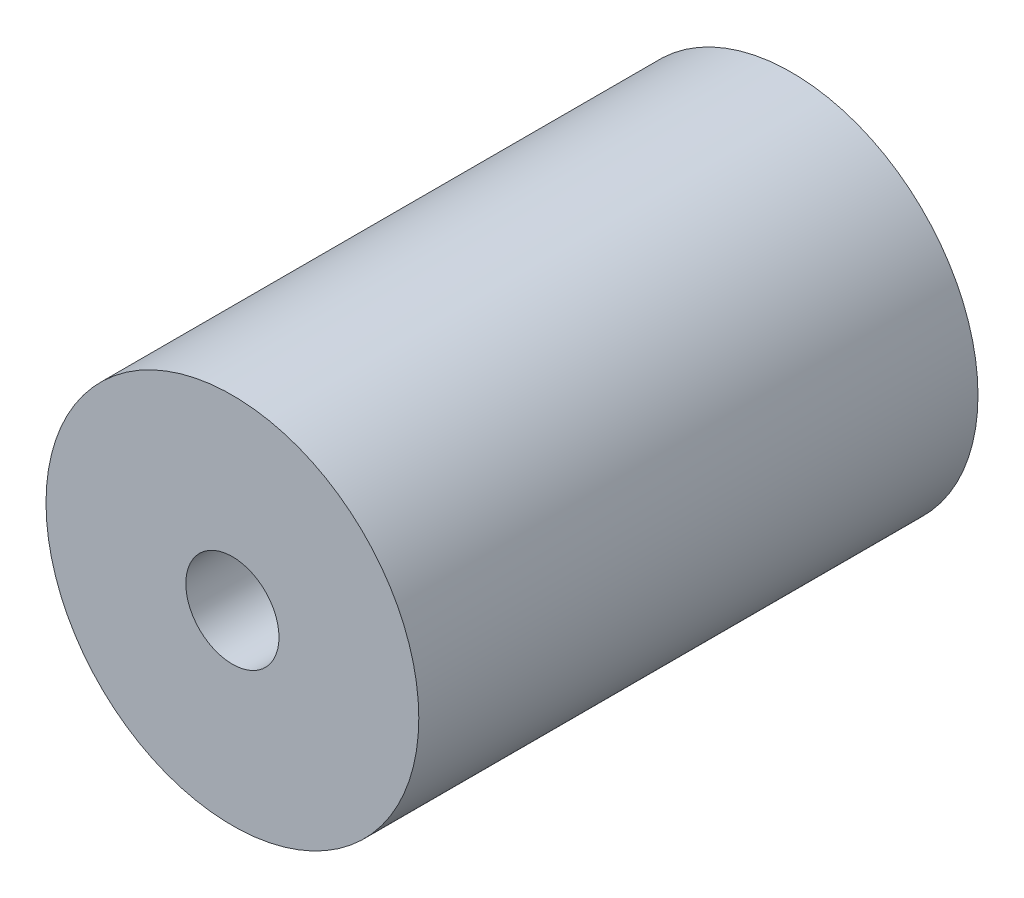
ISO-10303-21;
HEADER;
FILE_DESCRIPTION(('STEP AP214'),'2;1');
FILE_NAME('part.step','',(''),(''),'','','');
FILE_SCHEMA(('AUTOMOTIVE_DESIGN { 1 0 10303 214 1 1 1 1 }'));
ENDSEC;
DATA;
#1=APPLICATION_CONTEXT('core data for automotive mechanical design processes');
#2=APPLICATION_PROTOCOL_DEFINITION('international standard','automotive_design',2000,#1);
#3=PRODUCT_CONTEXT('',#1,'mechanical');
#4=PRODUCT('Part','Part','',(#3));
#5=PRODUCT_RELATED_PRODUCT_CATEGORY('part','',(#4));
#6=PRODUCT_DEFINITION_FORMATION('','',#4);
#7=PRODUCT_DEFINITION_CONTEXT('part definition',#1,'design');
#8=PRODUCT_DEFINITION('design','',#6,#7);
#9=PRODUCT_DEFINITION_SHAPE('','',#8);
#10=(LENGTH_UNIT() NAMED_UNIT(*) SI_UNIT(.MILLI.,.METRE.));
#11=(NAMED_UNIT(*) PLANE_ANGLE_UNIT() SI_UNIT($,.RADIAN.));
#12=(NAMED_UNIT(*) SI_UNIT($,.STERADIAN.) SOLID_ANGLE_UNIT());
#13=UNCERTAINTY_MEASURE_WITH_UNIT(LENGTH_MEASURE(1.E-05),#10,'distance_accuracy_value','');
#14=(GEOMETRIC_REPRESENTATION_CONTEXT(3) GLOBAL_UNCERTAINTY_ASSIGNED_CONTEXT((#13)) GLOBAL_UNIT_ASSIGNED_CONTEXT((#10,
#11,#12)) REPRESENTATION_CONTEXT('',''));
#15=CARTESIAN_POINT('',(0.,0.,0.));
#16=DIRECTION('',(0.,0.,1.));
#17=DIRECTION('',(1.,0.,0.));
#18=AXIS2_PLACEMENT_3D('',#15,#16,#17);
#19=CARTESIAN_POINT('',(0.,0.,30.));
#20=DIRECTION('',(0.,0.,1.));
#21=DIRECTION('',(1.,0.,0.));
#22=AXIS2_PLACEMENT_3D('',#19,#20,#21);
#23=PLANE('',#22);
#24=CARTESIAN_POINT('',(0.,0.,30.));
#25=DIRECTION('',(0.,0.,1.));
#26=DIRECTION('',(1.,0.,0.));
#27=AXIS2_PLACEMENT_3D('',#24,#25,#26);
#28=CIRCLE('',#27,10.);
#29=CARTESIAN_POINT('',(10.,0.,30.));
#30=VERTEX_POINT('',#29);
#31=EDGE_CURVE('E10',#30,#30,#28,.T.);
#32=ORIENTED_EDGE('',*,*,#31,.T.);
#33=EDGE_LOOP('',(#32));
#34=FACE_BOUND('',#33,.T.);
#35=CARTESIAN_POINT('',(0.,0.,30.));
#36=DIRECTION('',(0.,0.,1.));
#37=DIRECTION('',(1.,0.,0.));
#38=AXIS2_PLACEMENT_3D('',#35,#36,#37);
#39=CIRCLE('',#38,2.5);
#40=CARTESIAN_POINT('',(2.5,0.,30.));
#41=VERTEX_POINT('',#40);
#42=EDGE_CURVE('E42',#41,#41,#39,.T.);
#43=ORIENTED_EDGE('',*,*,#42,.F.);
#44=EDGE_LOOP('',(#43));
#45=FACE_BOUND('',#44,.T.);
#46=ADVANCED_FACE('F31',(#34,#45),#23,.T.);
#47=CARTESIAN_POINT('',(0.,0.,0.));
#48=DIRECTION('',(0.,0.,1.));
#49=DIRECTION('',(1.,0.,0.));
#50=AXIS2_PLACEMENT_3D('',#47,#48,#49);
#51=PLANE('',#50);
#52=CARTESIAN_POINT('',(0.,0.,0.));
#53=DIRECTION('',(0.,0.,1.));
#54=DIRECTION('',(1.,0.,0.));
#55=AXIS2_PLACEMENT_3D('',#52,#53,#54);
#56=CIRCLE('',#55,10.);
#57=CARTESIAN_POINT('',(10.,0.,0.));
#58=VERTEX_POINT('',#57);
#59=EDGE_CURVE('E35',#58,#58,#56,.T.);
#60=ORIENTED_EDGE('',*,*,#59,.F.);
#61=EDGE_LOOP('',(#60));
#62=FACE_BOUND('',#61,.T.);
#63=CARTESIAN_POINT('',(0.,0.,0.));
#64=DIRECTION('',(0.,0.,1.));
#65=DIRECTION('',(1.,0.,0.));
#66=AXIS2_PLACEMENT_3D('',#63,#64,#65);
#67=CIRCLE('',#66,2.5);
#68=CARTESIAN_POINT('',(2.5,0.,0.));
#69=VERTEX_POINT('',#68);
#70=EDGE_CURVE('E44',#69,#69,#67,.T.);
#71=ORIENTED_EDGE('',*,*,#70,.T.);
#72=EDGE_LOOP('',(#71));
#73=FACE_BOUND('',#72,.T.);
#74=ADVANCED_FACE('F54',(#62,#73),#51,.F.);
#75=CARTESIAN_POINT('',(0.,0.,30.));
#76=DIRECTION('',(0.,0.,-1.));
#77=DIRECTION('',(-1.,0.,0.));
#78=AXIS2_PLACEMENT_3D('',#75,#76,#77);
#79=CYLINDRICAL_SURFACE('',#78,10.);
#80=ORIENTED_EDGE('',*,*,#31,.F.);
#81=EDGE_LOOP('',(#80));
#82=FACE_BOUND('',#81,.T.);
#83=ORIENTED_EDGE('',*,*,#59,.T.);
#84=EDGE_LOOP('',(#83));
#85=FACE_BOUND('',#84,.T.);
#86=ADVANCED_FACE('F33',(#82,#85),#79,.T.);
#87=CARTESIAN_POINT('',(0.,0.,30.));
#88=DIRECTION('',(0.,0.,-1.));
#89=DIRECTION('',(-1.,0.,0.));
#90=AXIS2_PLACEMENT_3D('',#87,#88,#89);
#91=CYLINDRICAL_SURFACE('',#90,2.5);
#92=ORIENTED_EDGE('',*,*,#42,.T.);
#93=EDGE_LOOP('',(#92));
#94=FACE_BOUND('',#93,.T.);
#95=ORIENTED_EDGE('',*,*,#70,.F.);
#96=EDGE_LOOP('',(#95));
#97=FACE_BOUND('',#96,.T.);
#98=ADVANCED_FACE('F50',(#94,#97),#91,.F.);
#99=CLOSED_SHELL('',(#46,#74,#86,#98));
#100=MANIFOLD_SOLID_BREP('B2',#99);
#101=ADVANCED_BREP_SHAPE_REPRESENTATION('',(#18,#100),#14);
#102=SHAPE_DEFINITION_REPRESENTATION(#9,#101);
ENDSEC;
END-ISO-10303-21;
